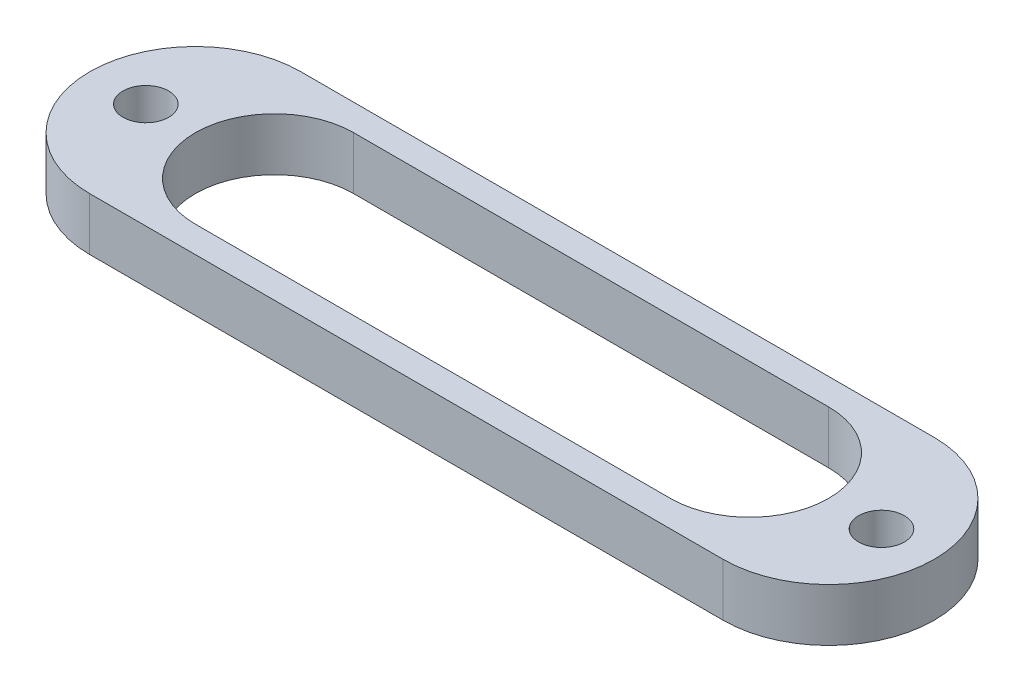
ISO-10303-21;
HEADER;
FILE_DESCRIPTION(('STEP AP214'),'2;1');
FILE_NAME('part.step','',(''),(''),'','','');
FILE_SCHEMA(('AUTOMOTIVE_DESIGN { 1 0 10303 214 1 1 1 1 }'));
ENDSEC;
DATA;
#1=APPLICATION_CONTEXT('core data for automotive mechanical design processes');
#2=APPLICATION_PROTOCOL_DEFINITION('international standard','automotive_design',2000,#1);
#3=PRODUCT_CONTEXT('',#1,'mechanical');
#4=PRODUCT('Part','Part','',(#3));
#5=PRODUCT_RELATED_PRODUCT_CATEGORY('part','',(#4));
#6=PRODUCT_DEFINITION_FORMATION('','',#4);
#7=PRODUCT_DEFINITION_CONTEXT('part definition',#1,'design');
#8=PRODUCT_DEFINITION('design','',#6,#7);
#9=PRODUCT_DEFINITION_SHAPE('','',#8);
#10=(LENGTH_UNIT() NAMED_UNIT(*) SI_UNIT(.MILLI.,.METRE.));
#11=(NAMED_UNIT(*) PLANE_ANGLE_UNIT() SI_UNIT($,.RADIAN.));
#12=(NAMED_UNIT(*) SI_UNIT($,.STERADIAN.) SOLID_ANGLE_UNIT());
#13=UNCERTAINTY_MEASURE_WITH_UNIT(LENGTH_MEASURE(1.E-05),#10,'distance_accuracy_value','');
#14=(GEOMETRIC_REPRESENTATION_CONTEXT(3) GLOBAL_UNCERTAINTY_ASSIGNED_CONTEXT((#13)) GLOBAL_UNIT_ASSIGNED_CONTEXT((#10,
#11,#12)) REPRESENTATION_CONTEXT('',''));
#15=CARTESIAN_POINT('',(0.,0.,0.));
#16=DIRECTION('',(0.,0.,1.));
#17=DIRECTION('',(1.,0.,0.));
#18=AXIS2_PLACEMENT_3D('',#15,#16,#17);
#19=CARTESIAN_POINT('',(0.,6.35,0.));
#20=DIRECTION('',(0.,1.,0.));
#21=DIRECTION('',(0.,0.,1.));
#22=AXIS2_PLACEMENT_3D('',#19,#20,#21);
#23=PLANE('',#22);
#24=CARTESIAN_POINT('',(-5.95000280655584,6.35,0.));
#25=DIRECTION('',(0.,1.,0.));
#26=DIRECTION('',(0.,0.,1.));
#27=AXIS2_PLACEMENT_3D('',#24,#25,#26);
#28=CIRCLE('',#27,2.74999999999999);
#29=CARTESIAN_POINT('',(-5.95000280655584,6.35,2.74999999999999));
#30=VERTEX_POINT('',#29);
#31=EDGE_CURVE('E231',#30,#30,#28,.T.);
#32=ORIENTED_EDGE('',*,*,#31,.F.);
#33=EDGE_LOOP('',(#32));
#34=FACE_BOUND('',#33,.T.);
#35=CARTESIAN_POINT('',(82.55,6.35,0.));
#36=DIRECTION('',(0.,1.,0.));
#37=DIRECTION('',(0.,0.,1.));
#38=AXIS2_PLACEMENT_3D('',#35,#36,#37);
#39=CIRCLE('',#38,2.74999999999999);
#40=CARTESIAN_POINT('',(82.55,6.35,2.74999999999999));
#41=VERTEX_POINT('',#40);
#42=EDGE_CURVE('E233',#41,#41,#39,.T.);
#43=ORIENTED_EDGE('',*,*,#42,.F.);
#44=EDGE_LOOP('',(#43));
#45=FACE_BOUND('',#44,.T.);
#46=CARTESIAN_POINT('',(0.,6.35,0.));
#47=DIRECTION('',(0.,1.,0.));
#48=DIRECTION('',(0.,0.,1.));
#49=AXIS2_PLACEMENT_3D('',#46,#47,#48);
#50=CIRCLE('',#49,12.7);
#51=CARTESIAN_POINT('',(0.,6.35,-12.7));
#52=VERTEX_POINT('',#51);
#53=CARTESIAN_POINT('',(0.,6.35,12.7));
#54=VERTEX_POINT('',#53);
#55=EDGE_CURVE('E136',#52,#54,#50,.T.);
#56=ORIENTED_EDGE('',*,*,#55,.T.);
#57=DIRECTION('',(1.,0.,0.));
#58=VECTOR('',#57,1.);
#59=CARTESIAN_POINT('',(0.,6.35,12.7));
#60=LINE('',#59,#58);
#61=CARTESIAN_POINT('',(76.2,6.35,12.7));
#62=VERTEX_POINT('',#61);
#63=EDGE_CURVE('E139',#54,#62,#60,.T.);
#64=ORIENTED_EDGE('',*,*,#63,.T.);
#65=CARTESIAN_POINT('',(76.2,6.35,0.));
#66=DIRECTION('',(0.,1.,0.));
#67=DIRECTION('',(0.,0.,1.));
#68=AXIS2_PLACEMENT_3D('',#65,#66,#67);
#69=CIRCLE('',#68,12.7);
#70=CARTESIAN_POINT('',(76.2,6.35,-12.7));
#71=VERTEX_POINT('',#70);
#72=EDGE_CURVE('E142',#62,#71,#69,.T.);
#73=ORIENTED_EDGE('',*,*,#72,.T.);
#74=DIRECTION('',(-1.,0.,0.));
#75=VECTOR('',#74,1.);
#76=CARTESIAN_POINT('',(0.,6.35,-12.7));
#77=LINE('',#76,#75);
#78=EDGE_CURVE('E144',#71,#52,#77,.T.);
#79=ORIENTED_EDGE('',*,*,#78,.T.);
#80=EDGE_LOOP('',(#56,#64,#73,#79));
#81=FACE_BOUND('',#80,.T.);
#82=DIRECTION('',(1.,0.,0.));
#83=VECTOR('',#82,1.);
#84=CARTESIAN_POINT('',(9.525,6.35,9.525));
#85=LINE('',#84,#83);
#86=CARTESIAN_POINT('',(9.525,6.35,9.525));
#87=VERTEX_POINT('',#86);
#88=CARTESIAN_POINT('',(66.675,6.35,9.52499999999999));
#89=VERTEX_POINT('',#88);
#90=EDGE_CURVE('E106',#87,#89,#85,.T.);
#91=ORIENTED_EDGE('',*,*,#90,.F.);
#92=CARTESIAN_POINT('',(9.525,6.35,0.));
#93=DIRECTION('',(0.,1.,0.));
#94=DIRECTION('',(0.,0.,1.));
#95=AXIS2_PLACEMENT_3D('',#92,#93,#94);
#96=CIRCLE('',#95,9.525);
#97=CARTESIAN_POINT('',(9.525,6.35,-9.525));
#98=VERTEX_POINT('',#97);
#99=EDGE_CURVE('E98',#98,#87,#96,.T.);
#100=ORIENTED_EDGE('',*,*,#99,.F.);
#101=DIRECTION('',(-1.,0.,0.));
#102=VECTOR('',#101,1.);
#103=CARTESIAN_POINT('',(9.525,6.35,-9.525));
#104=LINE('',#103,#102);
#105=CARTESIAN_POINT('',(66.675,6.35,-9.52500000000001));
#106=VERTEX_POINT('',#105);
#107=EDGE_CURVE('E120',#106,#98,#104,.T.);
#108=ORIENTED_EDGE('',*,*,#107,.F.);
#109=CARTESIAN_POINT('',(66.675,6.35,0.));
#110=DIRECTION('',(0.,1.,0.));
#111=DIRECTION('',(0.,0.,1.));
#112=AXIS2_PLACEMENT_3D('',#109,#110,#111);
#113=CIRCLE('',#112,9.525);
#114=EDGE_CURVE('E118',#89,#106,#113,.T.);
#115=ORIENTED_EDGE('',*,*,#114,.F.);
#116=EDGE_LOOP('',(#91,#100,#108,#115));
#117=FACE_BOUND('',#116,.T.);
#118=ADVANCED_FACE('F33',(#34,#45,#81,#117),#23,.T.);
#119=CARTESIAN_POINT('',(0.,0.,0.));
#120=DIRECTION('',(0.,1.,0.));
#121=DIRECTION('',(0.,0.,1.));
#122=AXIS2_PLACEMENT_3D('',#119,#120,#121);
#123=PLANE('',#122);
#124=CARTESIAN_POINT('',(-5.95000280655584,0.,0.));
#125=DIRECTION('',(0.,1.,0.));
#126=DIRECTION('',(0.,0.,1.));
#127=AXIS2_PLACEMENT_3D('',#124,#125,#126);
#128=CIRCLE('',#127,2.74999999999999);
#129=CARTESIAN_POINT('',(-5.95000280655584,0.,2.74999999999999));
#130=VERTEX_POINT('',#129);
#131=EDGE_CURVE('E229',#130,#130,#128,.T.);
#132=ORIENTED_EDGE('',*,*,#131,.T.);
#133=EDGE_LOOP('',(#132));
#134=FACE_BOUND('',#133,.T.);
#135=CARTESIAN_POINT('',(82.55,0.,0.));
#136=DIRECTION('',(0.,1.,0.));
#137=DIRECTION('',(0.,0.,1.));
#138=AXIS2_PLACEMENT_3D('',#135,#136,#137);
#139=CIRCLE('',#138,2.74999999999999);
#140=CARTESIAN_POINT('',(82.55,0.,2.74999999999999));
#141=VERTEX_POINT('',#140);
#142=EDGE_CURVE('E126',#141,#141,#139,.T.);
#143=ORIENTED_EDGE('',*,*,#142,.T.);
#144=EDGE_LOOP('',(#143));
#145=FACE_BOUND('',#144,.T.);
#146=CARTESIAN_POINT('',(0.,0.,0.));
#147=DIRECTION('',(0.,1.,0.));
#148=DIRECTION('',(0.,0.,1.));
#149=AXIS2_PLACEMENT_3D('',#146,#147,#148);
#150=CIRCLE('',#149,12.7);
#151=CARTESIAN_POINT('',(0.,0.,-12.7));
#152=VERTEX_POINT('',#151);
#153=CARTESIAN_POINT('',(0.,0.,12.7));
#154=VERTEX_POINT('',#153);
#155=EDGE_CURVE('E114',#152,#154,#150,.T.);
#156=ORIENTED_EDGE('',*,*,#155,.F.);
#157=DIRECTION('',(-1.,0.,0.));
#158=VECTOR('',#157,1.);
#159=CARTESIAN_POINT('',(0.,0.,-12.7));
#160=LINE('',#159,#158);
#161=CARTESIAN_POINT('',(76.2,0.,-12.7));
#162=VERTEX_POINT('',#161);
#163=EDGE_CURVE('E140',#162,#152,#160,.T.);
#164=ORIENTED_EDGE('',*,*,#163,.F.);
#165=CARTESIAN_POINT('',(76.2,0.,0.));
#166=DIRECTION('',(0.,1.,0.));
#167=DIRECTION('',(0.,0.,1.));
#168=AXIS2_PLACEMENT_3D('',#165,#166,#167);
#169=CIRCLE('',#168,12.7);
#170=CARTESIAN_POINT('',(76.2,0.,12.7));
#171=VERTEX_POINT('',#170);
#172=EDGE_CURVE('E151',#171,#162,#169,.T.);
#173=ORIENTED_EDGE('',*,*,#172,.F.);
#174=DIRECTION('',(1.,0.,0.));
#175=VECTOR('',#174,1.);
#176=CARTESIAN_POINT('',(0.,0.,12.7));
#177=LINE('',#176,#175);
#178=EDGE_CURVE('E149',#154,#171,#177,.T.);
#179=ORIENTED_EDGE('',*,*,#178,.F.);
#180=EDGE_LOOP('',(#156,#164,#173,#179));
#181=FACE_BOUND('',#180,.T.);
#182=CARTESIAN_POINT('',(9.525,0.,0.));
#183=DIRECTION('',(0.,1.,0.));
#184=DIRECTION('',(0.,0.,1.));
#185=AXIS2_PLACEMENT_3D('',#182,#183,#184);
#186=CIRCLE('',#185,9.525);
#187=CARTESIAN_POINT('',(9.525,0.,-9.525));
#188=VERTEX_POINT('',#187);
#189=CARTESIAN_POINT('',(9.525,0.,9.525));
#190=VERTEX_POINT('',#189);
#191=EDGE_CURVE('E56',#188,#190,#186,.T.);
#192=ORIENTED_EDGE('',*,*,#191,.T.);
#193=DIRECTION('',(1.,0.,0.));
#194=VECTOR('',#193,1.);
#195=CARTESIAN_POINT('',(9.525,0.,9.525));
#196=LINE('',#195,#194);
#197=CARTESIAN_POINT('',(66.675,0.,9.52499999999999));
#198=VERTEX_POINT('',#197);
#199=EDGE_CURVE('E113',#190,#198,#196,.T.);
#200=ORIENTED_EDGE('',*,*,#199,.T.);
#201=CARTESIAN_POINT('',(66.675,0.,0.));
#202=DIRECTION('',(0.,1.,0.));
#203=DIRECTION('',(0.,0.,1.));
#204=AXIS2_PLACEMENT_3D('',#201,#202,#203);
#205=CIRCLE('',#204,9.525);
#206=CARTESIAN_POINT('',(66.675,0.,-9.52500000000001));
#207=VERTEX_POINT('',#206);
#208=EDGE_CURVE('E128',#198,#207,#205,.T.);
#209=ORIENTED_EDGE('',*,*,#208,.T.);
#210=DIRECTION('',(-1.,0.,0.));
#211=VECTOR('',#210,1.);
#212=CARTESIAN_POINT('',(9.525,0.,-9.525));
#213=LINE('',#212,#211);
#214=EDGE_CURVE('E107',#207,#188,#213,.T.);
#215=ORIENTED_EDGE('',*,*,#214,.T.);
#216=EDGE_LOOP('',(#192,#200,#209,#215));
#217=FACE_BOUND('',#216,.T.);
#218=ADVANCED_FACE('F169',(#134,#145,#181,#217),#123,.F.);
#219=CARTESIAN_POINT('',(0.,6.35,0.));
#220=DIRECTION('',(0.,-1.,0.));
#221=DIRECTION('',(0.,0.,-1.));
#222=AXIS2_PLACEMENT_3D('',#219,#220,#221);
#223=CYLINDRICAL_SURFACE('',#222,12.7);
#224=ORIENTED_EDGE('',*,*,#155,.T.);
#225=DIRECTION('',(0.,-1.,0.));
#226=VECTOR('',#225,1.);
#227=CARTESIAN_POINT('',(0.,6.35,12.7));
#228=LINE('',#227,#226);
#229=EDGE_CURVE('E11',#54,#154,#228,.T.);
#230=ORIENTED_EDGE('',*,*,#229,.F.);
#231=ORIENTED_EDGE('',*,*,#55,.F.);
#232=DIRECTION('',(0.,-1.,0.));
#233=VECTOR('',#232,1.);
#234=CARTESIAN_POINT('',(0.,6.35,-12.7));
#235=LINE('',#234,#233);
#236=EDGE_CURVE('E146',#52,#152,#235,.T.);
#237=ORIENTED_EDGE('',*,*,#236,.T.);
#238=EDGE_LOOP('',(#224,#230,#231,#237));
#239=FACE_BOUND('',#238,.T.);
#240=ADVANCED_FACE('F35',(#239),#223,.T.);
#241=CARTESIAN_POINT('',(0.,6.35,12.7));
#242=DIRECTION('',(0.,0.,-1.));
#243=DIRECTION('',(-1.,0.,0.));
#244=AXIS2_PLACEMENT_3D('',#241,#242,#243);
#245=PLANE('',#244);
#246=ORIENTED_EDGE('',*,*,#178,.T.);
#247=DIRECTION('',(0.,-1.,0.));
#248=VECTOR('',#247,1.);
#249=CARTESIAN_POINT('',(76.2,6.35,12.7));
#250=LINE('',#249,#248);
#251=EDGE_CURVE('E41',#62,#171,#250,.T.);
#252=ORIENTED_EDGE('',*,*,#251,.F.);
#253=ORIENTED_EDGE('',*,*,#63,.F.);
#254=ORIENTED_EDGE('',*,*,#229,.T.);
#255=EDGE_LOOP('',(#246,#252,#253,#254));
#256=FACE_BOUND('',#255,.T.);
#257=ADVANCED_FACE('F179',(#256),#245,.F.);
#258=CARTESIAN_POINT('',(76.2,6.35,0.));
#259=DIRECTION('',(0.,-1.,0.));
#260=DIRECTION('',(0.,0.,-1.));
#261=AXIS2_PLACEMENT_3D('',#258,#259,#260);
#262=CYLINDRICAL_SURFACE('',#261,12.7);
#263=ORIENTED_EDGE('',*,*,#172,.T.);
#264=DIRECTION('',(0.,-1.,0.));
#265=VECTOR('',#264,1.);
#266=CARTESIAN_POINT('',(76.2,6.35,-12.7));
#267=LINE('',#266,#265);
#268=EDGE_CURVE('E156',#71,#162,#267,.T.);
#269=ORIENTED_EDGE('',*,*,#268,.F.);
#270=ORIENTED_EDGE('',*,*,#72,.F.);
#271=ORIENTED_EDGE('',*,*,#251,.T.);
#272=EDGE_LOOP('',(#263,#269,#270,#271));
#273=FACE_BOUND('',#272,.T.);
#274=ADVANCED_FACE('F163',(#273),#262,.T.);
#275=CARTESIAN_POINT('',(0.,6.35,-12.7));
#276=DIRECTION('',(0.,0.,1.));
#277=DIRECTION('',(1.,0.,0.));
#278=AXIS2_PLACEMENT_3D('',#275,#276,#277);
#279=PLANE('',#278);
#280=ORIENTED_EDGE('',*,*,#163,.T.);
#281=ORIENTED_EDGE('',*,*,#236,.F.);
#282=ORIENTED_EDGE('',*,*,#78,.F.);
#283=ORIENTED_EDGE('',*,*,#268,.T.);
#284=EDGE_LOOP('',(#280,#281,#282,#283));
#285=FACE_BOUND('',#284,.T.);
#286=ADVANCED_FACE('F173',(#285),#279,.F.);
#287=CARTESIAN_POINT('',(9.525,6.35,0.));
#288=DIRECTION('',(0.,-1.,0.));
#289=DIRECTION('',(0.,0.,-1.));
#290=AXIS2_PLACEMENT_3D('',#287,#288,#289);
#291=CYLINDRICAL_SURFACE('',#290,9.525);
#292=ORIENTED_EDGE('',*,*,#191,.F.);
#293=DIRECTION('',(0.,-1.,0.));
#294=VECTOR('',#293,1.);
#295=CARTESIAN_POINT('',(9.525,6.35,-9.525));
#296=LINE('',#295,#294);
#297=EDGE_CURVE('E102',#98,#188,#296,.T.);
#298=ORIENTED_EDGE('',*,*,#297,.F.);
#299=ORIENTED_EDGE('',*,*,#99,.T.);
#300=DIRECTION('',(0.,-1.,0.));
#301=VECTOR('',#300,1.);
#302=CARTESIAN_POINT('',(9.525,6.35,9.525));
#303=LINE('',#302,#301);
#304=EDGE_CURVE('E101',#87,#190,#303,.T.);
#305=ORIENTED_EDGE('',*,*,#304,.T.);
#306=EDGE_LOOP('',(#292,#298,#299,#305));
#307=FACE_BOUND('',#306,.T.);
#308=ADVANCED_FACE('F100',(#307),#291,.F.);
#309=CARTESIAN_POINT('',(9.525,6.35,9.525));
#310=DIRECTION('',(0.,0.,-1.));
#311=DIRECTION('',(-1.,0.,0.));
#312=AXIS2_PLACEMENT_3D('',#309,#310,#311);
#313=PLANE('',#312);
#314=ORIENTED_EDGE('',*,*,#199,.F.);
#315=ORIENTED_EDGE('',*,*,#304,.F.);
#316=ORIENTED_EDGE('',*,*,#90,.T.);
#317=DIRECTION('',(0.,-1.,0.));
#318=VECTOR('',#317,1.);
#319=CARTESIAN_POINT('',(66.675,6.35,9.52499999999999));
#320=LINE('',#319,#318);
#321=EDGE_CURVE('E115',#89,#198,#320,.T.);
#322=ORIENTED_EDGE('',*,*,#321,.T.);
#323=EDGE_LOOP('',(#314,#315,#316,#322));
#324=FACE_BOUND('',#323,.T.);
#325=ADVANCED_FACE('F110',(#324),#313,.T.);
#326=CARTESIAN_POINT('',(66.675,6.35,0.));
#327=DIRECTION('',(0.,-1.,0.));
#328=DIRECTION('',(0.,0.,-1.));
#329=AXIS2_PLACEMENT_3D('',#326,#327,#328);
#330=CYLINDRICAL_SURFACE('',#329,9.525);
#331=ORIENTED_EDGE('',*,*,#208,.F.);
#332=ORIENTED_EDGE('',*,*,#321,.F.);
#333=ORIENTED_EDGE('',*,*,#114,.T.);
#334=DIRECTION('',(0.,-1.,0.));
#335=VECTOR('',#334,1.);
#336=CARTESIAN_POINT('',(66.675,6.35,-9.52500000000001));
#337=LINE('',#336,#335);
#338=EDGE_CURVE('E48',#106,#207,#337,.T.);
#339=ORIENTED_EDGE('',*,*,#338,.T.);
#340=EDGE_LOOP('',(#331,#332,#333,#339));
#341=FACE_BOUND('',#340,.T.);
#342=ADVANCED_FACE('F207',(#341),#330,.F.);
#343=CARTESIAN_POINT('',(9.525,6.35,-9.525));
#344=DIRECTION('',(0.,0.,1.));
#345=DIRECTION('',(1.,0.,0.));
#346=AXIS2_PLACEMENT_3D('',#343,#344,#345);
#347=PLANE('',#346);
#348=ORIENTED_EDGE('',*,*,#214,.F.);
#349=ORIENTED_EDGE('',*,*,#338,.F.);
#350=ORIENTED_EDGE('',*,*,#107,.T.);
#351=ORIENTED_EDGE('',*,*,#297,.T.);
#352=EDGE_LOOP('',(#348,#349,#350,#351));
#353=FACE_BOUND('',#352,.T.);
#354=ADVANCED_FACE('F211',(#353),#347,.T.);
#355=CARTESIAN_POINT('',(82.55,6.35,0.));
#356=DIRECTION('',(0.,1.,0.));
#357=DIRECTION('',(0.,0.,1.));
#358=AXIS2_PLACEMENT_3D('',#355,#356,#357);
#359=CYLINDRICAL_SURFACE('',#358,2.74999999999999);
#360=ORIENTED_EDGE('',*,*,#142,.F.);
#361=EDGE_LOOP('',(#360));
#362=FACE_BOUND('',#361,.T.);
#363=ORIENTED_EDGE('',*,*,#42,.T.);
#364=EDGE_LOOP('',(#363));
#365=FACE_BOUND('',#364,.T.);
#366=ADVANCED_FACE('F217',(#362,#365),#359,.F.);
#367=CARTESIAN_POINT('',(-5.95000280655584,6.35,0.));
#368=DIRECTION('',(0.,1.,0.));
#369=DIRECTION('',(0.,0.,1.));
#370=AXIS2_PLACEMENT_3D('',#367,#368,#369);
#371=CYLINDRICAL_SURFACE('',#370,2.74999999999999);
#372=ORIENTED_EDGE('',*,*,#131,.F.);
#373=EDGE_LOOP('',(#372));
#374=FACE_BOUND('',#373,.T.);
#375=ORIENTED_EDGE('',*,*,#31,.T.);
#376=EDGE_LOOP('',(#375));
#377=FACE_BOUND('',#376,.T.);
#378=ADVANCED_FACE('F220',(#374,#377),#371,.F.);
#379=CLOSED_SHELL('',(#118,#218,#240,#257,#274,#286,#308,#325,#342,#354,#366,#378));
#380=MANIFOLD_SOLID_BREP('B2',#379);
#381=ADVANCED_BREP_SHAPE_REPRESENTATION('',(#18,#380),#14);
#382=SHAPE_DEFINITION_REPRESENTATION(#9,#381);
ENDSEC;
END-ISO-10303-21;
